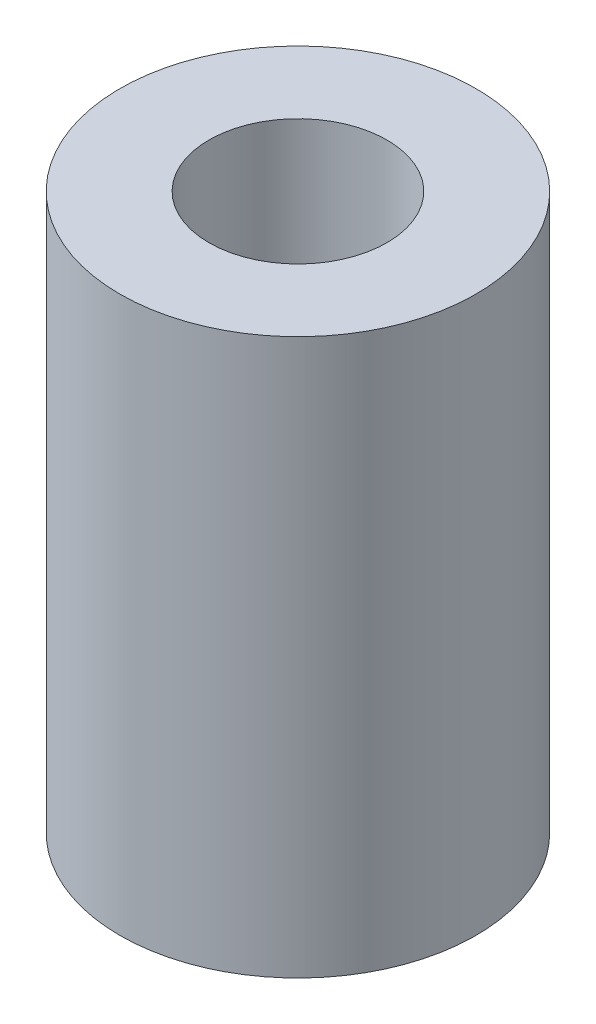
ISO-10303-21;
HEADER;
FILE_DESCRIPTION(('STEP AP214'),'2;1');
FILE_NAME('part.step','',(''),(''),'','','');
FILE_SCHEMA(('AUTOMOTIVE_DESIGN { 1 0 10303 214 1 1 1 1 }'));
ENDSEC;
DATA;
#1=APPLICATION_CONTEXT('core data for automotive mechanical design processes');
#2=APPLICATION_PROTOCOL_DEFINITION('international standard','automotive_design',2000,#1);
#3=PRODUCT_CONTEXT('',#1,'mechanical');
#4=PRODUCT('Part','Part','',(#3));
#5=PRODUCT_RELATED_PRODUCT_CATEGORY('part','',(#4));
#6=PRODUCT_DEFINITION_FORMATION('','',#4);
#7=PRODUCT_DEFINITION_CONTEXT('part definition',#1,'design');
#8=PRODUCT_DEFINITION('design','',#6,#7);
#9=PRODUCT_DEFINITION_SHAPE('','',#8);
#10=(LENGTH_UNIT() NAMED_UNIT(*) SI_UNIT(.MILLI.,.METRE.));
#11=(NAMED_UNIT(*) PLANE_ANGLE_UNIT() SI_UNIT($,.RADIAN.));
#12=(NAMED_UNIT(*) SI_UNIT($,.STERADIAN.) SOLID_ANGLE_UNIT());
#13=UNCERTAINTY_MEASURE_WITH_UNIT(LENGTH_MEASURE(1.E-05),#10,'distance_accuracy_value','');
#14=(GEOMETRIC_REPRESENTATION_CONTEXT(3) GLOBAL_UNCERTAINTY_ASSIGNED_CONTEXT((#13)) GLOBAL_UNIT_ASSIGNED_CONTEXT((#10,
#11,#12)) REPRESENTATION_CONTEXT('',''));
#15=CARTESIAN_POINT('',(0.,0.,0.));
#16=DIRECTION('',(0.,0.,1.));
#17=DIRECTION('',(1.,0.,0.));
#18=AXIS2_PLACEMENT_3D('',#15,#16,#17);
#19=CARTESIAN_POINT('',(0.,19.812,0.));
#20=DIRECTION('',(0.,1.,0.));
#21=DIRECTION('',(0.,0.,1.));
#22=AXIS2_PLACEMENT_3D('',#19,#20,#21);
#23=PLANE('',#22);
#24=CARTESIAN_POINT('',(0.,19.812,0.));
#25=DIRECTION('',(0.,1.,0.));
#26=DIRECTION('',(0.,0.,1.));
#27=AXIS2_PLACEMENT_3D('',#24,#25,#26);
#28=CIRCLE('',#27,6.35);
#29=CARTESIAN_POINT('',(0.,19.812,6.35));
#30=VERTEX_POINT('',#29);
#31=EDGE_CURVE('E10',#30,#30,#28,.T.);
#32=ORIENTED_EDGE('',*,*,#31,.T.);
#33=EDGE_LOOP('',(#32));
#34=FACE_BOUND('',#33,.T.);
#35=CARTESIAN_POINT('',(0.,19.812,0.));
#36=DIRECTION('',(0.,1.,0.));
#37=DIRECTION('',(0.,0.,1.));
#38=AXIS2_PLACEMENT_3D('',#35,#36,#37);
#39=CIRCLE('',#38,3.175);
#40=CARTESIAN_POINT('',(0.,19.812,3.175));
#41=VERTEX_POINT('',#40);
#42=EDGE_CURVE('E56',#41,#41,#39,.T.);
#43=ORIENTED_EDGE('',*,*,#42,.F.);
#44=EDGE_LOOP('',(#43));
#45=FACE_BOUND('',#44,.T.);
#46=ADVANCED_FACE('F43',(#34,#45),#23,.T.);
#47=CARTESIAN_POINT('',(0.,0.,0.));
#48=DIRECTION('',(0.,1.,0.));
#49=DIRECTION('',(0.,0.,1.));
#50=AXIS2_PLACEMENT_3D('',#47,#48,#49);
#51=PLANE('',#50);
#52=CARTESIAN_POINT('',(0.,0.,0.));
#53=DIRECTION('',(0.,1.,0.));
#54=DIRECTION('',(0.,0.,1.));
#55=AXIS2_PLACEMENT_3D('',#52,#53,#54);
#56=CIRCLE('',#55,6.35);
#57=CARTESIAN_POINT('',(0.,0.,6.35));
#58=VERTEX_POINT('',#57);
#59=EDGE_CURVE('E47',#58,#58,#56,.T.);
#60=ORIENTED_EDGE('',*,*,#59,.F.);
#61=EDGE_LOOP('',(#60));
#62=FACE_BOUND('',#61,.T.);
#63=CARTESIAN_POINT('',(0.,0.,0.));
#64=DIRECTION('',(0.,1.,0.));
#65=DIRECTION('',(0.,0.,1.));
#66=AXIS2_PLACEMENT_3D('',#63,#64,#65);
#67=CIRCLE('',#66,3.175);
#68=CARTESIAN_POINT('',(0.,0.,3.175));
#69=VERTEX_POINT('',#68);
#70=EDGE_CURVE('E58',#69,#69,#67,.T.);
#71=ORIENTED_EDGE('',*,*,#70,.T.);
#72=EDGE_LOOP('',(#71));
#73=FACE_BOUND('',#72,.T.);
#74=ADVANCED_FACE('F70',(#62,#73),#51,.F.);
#75=CARTESIAN_POINT('',(0.,19.812,0.));
#76=DIRECTION('',(0.,-1.,0.));
#77=DIRECTION('',(0.,0.,-1.));
#78=AXIS2_PLACEMENT_3D('',#75,#76,#77);
#79=CYLINDRICAL_SURFACE('',#78,6.35);
#80=ORIENTED_EDGE('',*,*,#31,.F.);
#81=EDGE_LOOP('',(#80));
#82=FACE_BOUND('',#81,.T.);
#83=ORIENTED_EDGE('',*,*,#59,.T.);
#84=EDGE_LOOP('',(#83));
#85=FACE_BOUND('',#84,.T.);
#86=ADVANCED_FACE('F45',(#82,#85),#79,.T.);
#87=CARTESIAN_POINT('',(0.,19.812,0.));
#88=DIRECTION('',(0.,-1.,0.));
#89=DIRECTION('',(0.,0.,-1.));
#90=AXIS2_PLACEMENT_3D('',#87,#88,#89);
#91=CYLINDRICAL_SURFACE('',#90,3.175);
#92=ORIENTED_EDGE('',*,*,#42,.T.);
#93=EDGE_LOOP('',(#92));
#94=FACE_BOUND('',#93,.T.);
#95=ORIENTED_EDGE('',*,*,#70,.F.);
#96=EDGE_LOOP('',(#95));
#97=FACE_BOUND('',#96,.T.);
#98=ADVANCED_FACE('F66',(#94,#97),#91,.F.);
#99=CLOSED_SHELL('',(#46,#74,#86,#98));
#100=MANIFOLD_SOLID_BREP('B2',#99);
#101=ADVANCED_BREP_SHAPE_REPRESENTATION('',(#18,#100),#14);
#102=SHAPE_DEFINITION_REPRESENTATION(#9,#101);
ENDSEC;
END-ISO-10303-21;
